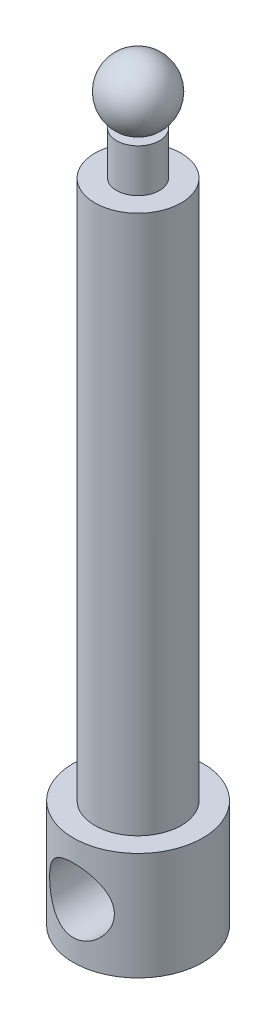
ISO-10303-21;
HEADER;
FILE_DESCRIPTION(('STEP AP214'),'2;1');
FILE_NAME('part.step','',(''),(''),'','','');
FILE_SCHEMA(('AUTOMOTIVE_DESIGN { 1 0 10303 214 1 1 1 1 }'));
ENDSEC;
DATA;
#1=APPLICATION_CONTEXT('core data for automotive mechanical design processes');
#2=APPLICATION_PROTOCOL_DEFINITION('international standard','automotive_design',2000,#1);
#3=PRODUCT_CONTEXT('',#1,'mechanical');
#4=PRODUCT('Part','Part','',(#3));
#5=PRODUCT_RELATED_PRODUCT_CATEGORY('part','',(#4));
#6=PRODUCT_DEFINITION_FORMATION('','',#4);
#7=PRODUCT_DEFINITION_CONTEXT('part definition',#1,'design');
#8=PRODUCT_DEFINITION('design','',#6,#7);
#9=PRODUCT_DEFINITION_SHAPE('','',#8);
#10=(LENGTH_UNIT() NAMED_UNIT(*) SI_UNIT(.MILLI.,.METRE.));
#11=(NAMED_UNIT(*) PLANE_ANGLE_UNIT() SI_UNIT($,.RADIAN.));
#12=(NAMED_UNIT(*) SI_UNIT($,.STERADIAN.) SOLID_ANGLE_UNIT());
#13=UNCERTAINTY_MEASURE_WITH_UNIT(LENGTH_MEASURE(1.E-05),#10,'distance_accuracy_value','');
#14=(GEOMETRIC_REPRESENTATION_CONTEXT(3) GLOBAL_UNCERTAINTY_ASSIGNED_CONTEXT((#13)) GLOBAL_UNIT_ASSIGNED_CONTEXT((#10,
#11,#12)) REPRESENTATION_CONTEXT('',''));
#15=CARTESIAN_POINT('',(0.,0.,0.));
#16=DIRECTION('',(0.,0.,1.));
#17=DIRECTION('',(1.,0.,0.));
#18=AXIS2_PLACEMENT_3D('',#15,#16,#17);
#19=CARTESIAN_POINT('',(0.,25.,0.));
#20=DIRECTION('',(0.,1.,0.));
#21=DIRECTION('',(0.,0.,1.));
#22=AXIS2_PLACEMENT_3D('',#19,#20,#21);
#23=PLANE('',#22);
#24=CARTESIAN_POINT('',(0.,25.,0.));
#25=DIRECTION('',(0.,1.,0.));
#26=DIRECTION('',(0.,0.,1.));
#27=AXIS2_PLACEMENT_3D('',#24,#25,#26);
#28=CIRCLE('',#27,2.);
#29=CARTESIAN_POINT('',(0.,25.,2.));
#30=VERTEX_POINT('',#29);
#31=EDGE_CURVE('E62',#30,#30,#28,.T.);
#32=ORIENTED_EDGE('',*,*,#31,.T.);
#33=EDGE_LOOP('',(#32));
#34=FACE_BOUND('',#33,.T.);
#35=CARTESIAN_POINT('',(0.,25.,0.));
#36=DIRECTION('',(0.,1.,0.));
#37=DIRECTION('',(0.,0.,1.));
#38=AXIS2_PLACEMENT_3D('',#35,#36,#37);
#39=CIRCLE('',#38,1.);
#40=CARTESIAN_POINT('',(0.,25.,1.));
#41=VERTEX_POINT('',#40);
#42=EDGE_CURVE('E115',#41,#41,#39,.T.);
#43=ORIENTED_EDGE('',*,*,#42,.F.);
#44=EDGE_LOOP('',(#43));
#45=FACE_BOUND('',#44,.T.);
#46=ADVANCED_FACE('F36',(#34,#45),#23,.T.);
#47=CARTESIAN_POINT('',(0.,25.,0.));
#48=DIRECTION('',(0.,-1.,0.));
#49=DIRECTION('',(0.,0.,-1.));
#50=AXIS2_PLACEMENT_3D('',#47,#48,#49);
#51=CYLINDRICAL_SURFACE('',#50,2.);
#52=ORIENTED_EDGE('',*,*,#31,.F.);
#53=EDGE_LOOP('',(#52));
#54=FACE_BOUND('',#53,.T.);
#55=CARTESIAN_POINT('',(0.,0.,0.));
#56=DIRECTION('',(0.,-1.,0.));
#57=DIRECTION('',(0.,0.,-1.));
#58=AXIS2_PLACEMENT_3D('',#55,#56,#57);
#59=CIRCLE('',#58,2.);
#60=CARTESIAN_POINT('',(0.,0.,-2.));
#61=VERTEX_POINT('',#60);
#62=EDGE_CURVE('E119',#61,#61,#59,.T.);
#63=ORIENTED_EDGE('',*,*,#62,.F.);
#64=EDGE_LOOP('',(#63));
#65=FACE_BOUND('',#64,.T.);
#66=ADVANCED_FACE('F38',(#54,#65),#51,.T.);
#67=CARTESIAN_POINT('',(0.,27.,0.));
#68=DIRECTION('',(0.,-1.,0.));
#69=DIRECTION('',(0.,0.,-1.));
#70=AXIS2_PLACEMENT_3D('',#67,#68,#69);
#71=CYLINDRICAL_SURFACE('',#70,1.);
#72=CARTESIAN_POINT('',(0.,27.,0.));
#73=DIRECTION('',(0.,1.,0.));
#74=DIRECTION('',(0.,0.,1.));
#75=AXIS2_PLACEMENT_3D('',#72,#73,#74);
#76=CIRCLE('',#75,1.);
#77=CARTESIAN_POINT('',(0.,27.,1.));
#78=VERTEX_POINT('',#77);
#79=EDGE_CURVE('E113',#78,#78,#76,.T.);
#80=ORIENTED_EDGE('',*,*,#79,.F.);
#81=EDGE_LOOP('',(#80));
#82=FACE_BOUND('',#81,.T.);
#83=ORIENTED_EDGE('',*,*,#42,.T.);
#84=EDGE_LOOP('',(#83));
#85=FACE_BOUND('',#84,.T.);
#86=ADVANCED_FACE('F97',(#82,#85),#71,.T.);
#87=CARTESIAN_POINT('',(0.,27.,0.));
#88=DIRECTION('',(0.,1.,0.));
#89=DIRECTION('',(0.,0.,1.));
#90=AXIS2_PLACEMENT_3D('',#87,#88,#89);
#91=PLANE('',#90);
#92=CARTESIAN_POINT('',(0.,27.,0.));
#93=DIRECTION('',(0.,1.,0.));
#94=DIRECTION('',(0.,0.,1.));
#95=AXIS2_PLACEMENT_3D('',#92,#93,#94);
#96=CIRCLE('',#95,0.279177848900644);
#97=CARTESIAN_POINT('',(0.,27.,0.279177848900644));
#98=VERTEX_POINT('',#97);
#99=EDGE_CURVE('E55',#98,#98,#96,.T.);
#100=ORIENTED_EDGE('',*,*,#99,.F.);
#101=EDGE_LOOP('',(#100));
#102=FACE_BOUND('',#101,.T.);
#103=ORIENTED_EDGE('',*,*,#79,.T.);
#104=EDGE_LOOP('',(#103));
#105=FACE_BOUND('',#104,.T.);
#106=ADVANCED_FACE('F88',(#102,#105),#91,.T.);
#107=CARTESIAN_POINT('',(0.,28.473790937916,0.));
#108=DIRECTION('',(0.,-1.,0.));
#109=DIRECTION('',(-1.,0.,0.));
#110=AXIS2_PLACEMENT_3D('',#107,#108,#109);
#111=SPHERICAL_SURFACE('',#110,1.5);
#112=ORIENTED_EDGE('',*,*,#99,.T.);
#113=EDGE_LOOP('',(#112));
#114=FACE_BOUND('',#113,.T.);
#115=ADVANCED_FACE('F82',(#114),#111,.T.);
#116=CARTESIAN_POINT('',(0.,0.,0.));
#117=DIRECTION('',(0.,-1.,0.));
#118=DIRECTION('',(0.,0.,-1.));
#119=AXIS2_PLACEMENT_3D('',#116,#117,#118);
#120=PLANE('',#119);
#121=CARTESIAN_POINT('',(0.,0.,0.));
#122=DIRECTION('',(0.,-1.,0.));
#123=DIRECTION('',(0.,0.,-1.));
#124=AXIS2_PLACEMENT_3D('',#121,#122,#123);
#125=CIRCLE('',#124,3.);
#126=CARTESIAN_POINT('',(0.,0.,-3.));
#127=VERTEX_POINT('',#126);
#128=EDGE_CURVE('E125',#127,#127,#125,.T.);
#129=ORIENTED_EDGE('',*,*,#128,.F.);
#130=EDGE_LOOP('',(#129));
#131=FACE_BOUND('',#130,.T.);
#132=ORIENTED_EDGE('',*,*,#62,.T.);
#133=EDGE_LOOP('',(#132));
#134=FACE_BOUND('',#133,.T.);
#135=ADVANCED_FACE('F80',(#131,#134),#120,.F.);
#136=CARTESIAN_POINT('',(0.,-5.,0.));
#137=DIRECTION('',(0.,1.,0.));
#138=DIRECTION('',(0.,0.,1.));
#139=AXIS2_PLACEMENT_3D('',#136,#137,#138);
#140=CYLINDRICAL_SURFACE('',#139,3.);
#141=CARTESIAN_POINT('',(0.,-1.,-3.));
#142=CARTESIAN_POINT('',(-0.0788579444268502,-1.00000495347579,-2.99999570107562));
#143=CARTESIAN_POINT('',(-0.157809899546344,-1.00625510968158,-2.99685736529635));
#144=CARTESIAN_POINT('',(-0.313380352903344,-1.03097932051231,-2.98461234055736));
#145=CARTESIAN_POINT('',(-0.389994130070444,-1.04947658949672,-2.97549431743379));
#146=CARTESIAN_POINT('',(-0.538400317320673,-1.09779071292494,-2.95224419105063));
#147=CARTESIAN_POINT('',(-0.610210204408719,-1.12756357637195,-2.93813158766306));
#148=CARTESIAN_POINT('',(-0.747708925209898,-1.19735593204748,-2.90618664773642));
#149=CARTESIAN_POINT('',(-0.813398240985089,-1.2373746163733,-2.88835460450288));
#150=CARTESIAN_POINT('',(-0.941261726642864,-1.32927587422793,-2.84934387387093));
#151=CARTESIAN_POINT('',(-1.00298281668316,-1.38172971885946,-2.82802798691306));
#152=CARTESIAN_POINT('',(-1.11716916730047,-1.49578221887056,-2.78489955370115));
#153=CARTESIAN_POINT('',(-1.16962737466015,-1.55738777765866,-2.76308664313552));
#154=CARTESIAN_POINT('',(-1.26787800067542,-1.69372502428507,-2.71948426796021));
#155=CARTESIAN_POINT('',(-1.31283800332746,-1.76910414751887,-2.69782780455198));
#156=CARTESIAN_POINT('',(-1.38925234033604,-1.92755100397932,-2.65928968158481));
#157=CARTESIAN_POINT('',(-1.4207163224495,-2.01061319308412,-2.64240461410484));
#158=CARTESIAN_POINT('',(-1.46719866328288,-2.17699765813288,-2.61686800556713));
#159=CARTESIAN_POINT('',(-1.48308878562066,-2.26000667810109,-2.6077840737557));
#160=CARTESIAN_POINT('',(-1.50064048996327,-2.42796825666922,-2.59772834922792));
#161=CARTESIAN_POINT('',(-1.50231613255961,-2.51291881130673,-2.59674854014932));
#162=CARTESIAN_POINT('',(-1.49203093075844,-2.67142903647305,-2.60266395385873));
#163=CARTESIAN_POINT('',(-1.48167683930523,-2.74513604683458,-2.6086314549302));
#164=CARTESIAN_POINT('',(-1.4504097735854,-2.88958286405956,-2.62614343100775));
#165=CARTESIAN_POINT('',(-1.42949343584648,-2.96032171795797,-2.63768968247664));
#166=CARTESIAN_POINT('',(-1.37731467057901,-3.09884369884849,-2.66531214619112));
#167=CARTESIAN_POINT('',(-1.34582260067399,-3.16651959817868,-2.68148760995998));
#168=CARTESIAN_POINT('',(-1.273562531502,-3.29595143888501,-2.71655106422106));
#169=CARTESIAN_POINT('',(-1.2327903657187,-3.35770470340013,-2.73544027170286));
#170=CARTESIAN_POINT('',(-1.13709908236918,-3.48178187911484,-2.77669736854929));
#171=CARTESIAN_POINT('',(-1.08104168755392,-3.54318531036424,-2.79920265355119));
#172=CARTESIAN_POINT('',(-0.95933336811206,-3.65610312788635,-2.84321434950611));
#173=CARTESIAN_POINT('',(-0.893677884861428,-3.70761278805082,-2.86472027938201));
#174=CARTESIAN_POINT('',(-0.750774758747772,-3.80152849154459,-2.90552980924446));
#175=CARTESIAN_POINT('',(-0.673130387399112,-3.84340070866861,-2.92468476243011));
#176=CARTESIAN_POINT('',(-0.510699323233194,-3.91314554356451,-2.95736821681863));
#177=CARTESIAN_POINT('',(-0.425918364397912,-3.94102927752275,-2.9709011841533));
#178=CARTESIAN_POINT('',(-0.259149737491052,-3.97971310557502,-2.98986500612153));
#179=CARTESIAN_POINT('',(-0.177512295822488,-3.99173685362017,-2.99587407451965));
#180=CARTESIAN_POINT('',(-0.0131693999240269,-4.00219709670173,-3.00109520188655));
#181=CARTESIAN_POINT('',(0.0695355298048636,-4.0006400284592,-3.00031048081978));
#182=CARTESIAN_POINT('',(0.226849457978981,-3.98468996737188,-2.99236788380152));
#183=CARTESIAN_POINT('',(0.301589112074895,-3.97130120090501,-2.98570868532252));
#184=CARTESIAN_POINT('',(0.447610338452912,-3.93364289215732,-2.9673325697226));
#185=CARTESIAN_POINT('',(0.518891528536631,-3.90937215031976,-2.95561509501618));
#186=CARTESIAN_POINT('',(0.658332912674359,-3.85000230035045,-2.92776377120382));
#187=CARTESIAN_POINT('',(0.726345595508705,-3.81461342482557,-2.91151322654446));
#188=CARTESIAN_POINT('',(0.855692042548907,-3.73433869653015,-2.87615961476126));
#189=CARTESIAN_POINT('',(0.917022944664887,-3.68944879810691,-2.85705533350407));
#190=CARTESIAN_POINT('',(1.03765153393382,-3.58635936200392,-2.81562332004297));
#191=CARTESIAN_POINT('',(1.09615811672854,-3.52728569733228,-2.79316327265249));
#192=CARTESIAN_POINT('',(1.20278448167828,-3.40011227308341,-2.7489358741323));
#193=CARTESIAN_POINT('',(1.25089707856781,-3.33200632172812,-2.72716901100071));
#194=CARTESIAN_POINT('',(1.33756187171853,-3.18453451874054,-2.68576788309734));
#195=CARTESIAN_POINT('',(1.37553824370037,-3.10478310085828,-2.66628794383591));
#196=CARTESIAN_POINT('',(1.43712423890206,-2.93873489863755,-2.63361108441202));
#197=CARTESIAN_POINT('',(1.46075237380052,-2.85244671029966,-2.62040607332625));
#198=CARTESIAN_POINT('',(1.49079253120031,-2.68463466567294,-2.60342251538703));
#199=CARTESIAN_POINT('',(1.49863949460818,-2.60344861984714,-2.59886075197597));
#200=CARTESIAN_POINT('',(1.5010337315643,-2.44082939925321,-2.59748031962405));
#201=CARTESIAN_POINT('',(1.49558676993486,-2.35939634689321,-2.60065829439585));
#202=CARTESIAN_POINT('',(1.47288918838996,-2.20677474769984,-2.61356793076615));
#203=CARTESIAN_POINT('',(1.45681247151455,-2.13534929478289,-2.62264641723988));
#204=CARTESIAN_POINT('',(1.41476303733662,-1.99628782086345,-2.64556524281479));
#205=CARTESIAN_POINT('',(1.38878713673988,-1.92865302686195,-2.65940711354503));
#206=CARTESIAN_POINT('',(1.32572361795085,-1.79406272352019,-2.69142795546804));
#207=CARTESIAN_POINT('',(1.28800670672355,-1.72745814725646,-2.70983583593881));
#208=CARTESIAN_POINT('',(1.20322645745609,-1.60108819572811,-2.74852997452291));
#209=CARTESIAN_POINT('',(1.15615825686234,-1.54132640421833,-2.76881720693416));
#210=CARTESIAN_POINT('',(1.04730498999206,-1.42278702646799,-2.81193484737138));
#211=CARTESIAN_POINT('',(0.984426634495891,-1.36501134647456,-2.83477474959942));
#212=CARTESIAN_POINT('',(0.849232209349795,-1.2606055248471,-2.87816628389896));
#213=CARTESIAN_POINT('',(0.776911084957795,-1.21398139079514,-2.89871667939293));
#214=CARTESIAN_POINT('',(0.623897395174418,-1.13314545593189,-2.93547014349806));
#215=CARTESIAN_POINT('',(0.543149255665095,-1.0990237461453,-2.95164144740899));
#216=CARTESIAN_POINT('',(0.376113151707129,-1.04528774836389,-2.9775201194848));
#217=CARTESIAN_POINT('',(0.289841699383649,-1.02563222979143,-2.98724585044602));
#218=CARTESIAN_POINT('',(0.168902919736342,-1.00915388337139,-2.99543192870217));
#219=CARTESIAN_POINT('',(0.135242819162347,-1.00572603870049,-2.99714048010376));
#220=CARTESIAN_POINT('',(0.0677275977076371,-1.00114800172887,-2.99942545465223));
#221=CARTESIAN_POINT('',(0.0338724714699425,-0.999997872294687,-3.00000184655071));
#222=CARTESIAN_POINT('',(0.,-1.,-3.));
#223=B_SPLINE_CURVE_WITH_KNOTS('',3,(#141,#142,#143,#144,#145,#146,#147,#148,#149,#150,#151,
#152,#153,#154,#155,#156,#157,#158,#159,#160,#161,#162,#163,#164,#165,#166,#167,#168,#169,#170,
#171,#172,#173,#174,#175,#176,#177,#178,#179,#180,#181,#182,#183,#184,#185,#186,#187,#188,#189,
#190,#191,#192,#193,#194,#195,#196,#197,#198,#199,#200,#201,#202,#203,#204,#205,#206,#207,#208,
#209,#210,#211,#212,#213,#214,#215,#216,#217,#218,#219,#220,#221,#222),.UNSPECIFIED.,.T.,.F.,(4,
2,2,2,2,2,2,2,2,2,2,2,2,2,2,2,2,2,2,2,2,2,2,2,2,2,2,2,2,2,2,2,2,2,2,2,2,2,2,2,4),(0.,
0.236436386130439,0.473322224563796,0.709293233238447,0.945245640872352,1.19547263807713,
1.44588935648105,1.71572589646129,1.98536921847421,2.23887018210344,2.49212035993531,
2.71508568613981,2.93812205888518,3.16635360252731,3.39468781890333,3.65197412000818,
3.9093830189803,4.17874533321661,4.4478932536842,4.69474935707019,4.94148846767214,
5.16910359759183,5.39674382446397,5.63089284041848,5.86514176122509,6.12239415966628,
6.37982382923148,6.64972023242589,6.91926767918176,7.1629396125457,7.40650589797018,
7.62686895373284,7.84730293182527,8.08254685170431,8.31791341715446,8.58187864135757,
8.84598575071869,9.1119602049529,9.37717362931724,9.47872920200875,9.58028757766599),.UNSPECIFIED.);
#224=CARTESIAN_POINT('',(0.,-1.,-3.));
#225=VERTEX_POINT('',#224);
#226=EDGE_CURVE('E10',#225,#225,#223,.T.);
#227=ORIENTED_EDGE('',*,*,#226,.T.);
#228=EDGE_LOOP('',(#227));
#229=FACE_BOUND('',#228,.T.);
#230=CARTESIAN_POINT('',(0.,-4.,3.));
#231=CARTESIAN_POINT('',(-0.0788579444268502,-3.99999504652421,2.99999570107562));
#232=CARTESIAN_POINT('',(-0.157809899546344,-3.99374489031842,2.99685736529635));
#233=CARTESIAN_POINT('',(-0.313380352903344,-3.96902067948769,2.98461234055736));
#234=CARTESIAN_POINT('',(-0.389994130070444,-3.95052341050328,2.97549431743379));
#235=CARTESIAN_POINT('',(-0.538400317320674,-3.90220928707506,2.95224419105063));
#236=CARTESIAN_POINT('',(-0.61021020440872,-3.87243642362805,2.93813158766306));
#237=CARTESIAN_POINT('',(-0.747708925209898,-3.80264406795252,2.90618664773642));
#238=CARTESIAN_POINT('',(-0.813398240985089,-3.7626253836267,2.88835460450288));
#239=CARTESIAN_POINT('',(-0.941261726642864,-3.67072412577207,2.84934387387093));
#240=CARTESIAN_POINT('',(-1.00298281668316,-3.61827028114054,2.82802798691306));
#241=CARTESIAN_POINT('',(-1.11716916730047,-3.50421778112944,2.78489955370115));
#242=CARTESIAN_POINT('',(-1.16962737466015,-3.44261222234134,2.76308664313552));
#243=CARTESIAN_POINT('',(-1.26787800067542,-3.30627497571493,2.71948426796021));
#244=CARTESIAN_POINT('',(-1.31283800332746,-3.23089585248113,2.69782780455198));
#245=CARTESIAN_POINT('',(-1.38925234033604,-3.07244899602068,2.65928968158481));
#246=CARTESIAN_POINT('',(-1.4207163224495,-2.98938680691587,2.64240461410484));
#247=CARTESIAN_POINT('',(-1.46719866328288,-2.82300234186711,2.61686800556713));
#248=CARTESIAN_POINT('',(-1.48308878562066,-2.73999332189891,2.6077840737557));
#249=CARTESIAN_POINT('',(-1.50064048996327,-2.57203174333078,2.59772834922792));
#250=CARTESIAN_POINT('',(-1.50231613255961,-2.48708118869327,2.59674854014932));
#251=CARTESIAN_POINT('',(-1.49203093075844,-2.32857096352695,2.60266395385873));
#252=CARTESIAN_POINT('',(-1.48167683930523,-2.25486395316542,2.6086314549302));
#253=CARTESIAN_POINT('',(-1.4504097735854,-2.11041713594044,2.62614343100776));
#254=CARTESIAN_POINT('',(-1.42949343584648,-2.03967828204203,2.63768968247665));
#255=CARTESIAN_POINT('',(-1.377314670579,-1.90115630115151,2.66531214619112));
#256=CARTESIAN_POINT('',(-1.34582260067399,-1.83348040182132,2.68148760995998));
#257=CARTESIAN_POINT('',(-1.273562531502,-1.70404856111499,2.71655106422106));
#258=CARTESIAN_POINT('',(-1.2327903657187,-1.64229529659987,2.73544027170286));
#259=CARTESIAN_POINT('',(-1.13709908236918,-1.51821812088516,2.77669736854929));
#260=CARTESIAN_POINT('',(-1.08104168755392,-1.45681468963576,2.79920265355119));
#261=CARTESIAN_POINT('',(-0.95933336811206,-1.34389687211365,2.84321434950611));
#262=CARTESIAN_POINT('',(-0.893677884861427,-1.29238721194918,2.86472027938201));
#263=CARTESIAN_POINT('',(-0.750774758747772,-1.19847150845541,2.90552980924446));
#264=CARTESIAN_POINT('',(-0.673130387399112,-1.15659929133139,2.92468476243011));
#265=CARTESIAN_POINT('',(-0.510699323233194,-1.08685445643549,2.95736821681863));
#266=CARTESIAN_POINT('',(-0.425918364397913,-1.05897072247725,2.9709011841533));
#267=CARTESIAN_POINT('',(-0.259149737491053,-1.02028689442498,2.98986500612153));
#268=CARTESIAN_POINT('',(-0.177512295822489,-1.00826314637983,2.99587407451965));
#269=CARTESIAN_POINT('',(-0.0131693999240269,-0.997802903298269,3.00109520188655));
#270=CARTESIAN_POINT('',(0.0695355298048637,-0.999359971540798,3.00031048081978));
#271=CARTESIAN_POINT('',(0.226849457978981,-1.01531003262812,2.99236788380152));
#272=CARTESIAN_POINT('',(0.301589112074896,-1.02869879909499,2.98570868532252));
#273=CARTESIAN_POINT('',(0.447610338452912,-1.06635710784268,2.9673325697226));
#274=CARTESIAN_POINT('',(0.518891528536631,-1.09062784968024,2.95561509501618));
#275=CARTESIAN_POINT('',(0.65833291267436,-1.14999769964955,2.92776377120382));
#276=CARTESIAN_POINT('',(0.726345595508706,-1.18538657517443,2.91151322654446));
#277=CARTESIAN_POINT('',(0.855692042548908,-1.26566130346985,2.87615961476126));
#278=CARTESIAN_POINT('',(0.917022944664888,-1.31055120189309,2.85705533350407));
#279=CARTESIAN_POINT('',(1.03765153393382,-1.41364063799608,2.81562332004297));
#280=CARTESIAN_POINT('',(1.09615811672854,-1.47271430266772,2.79316327265249));
#281=CARTESIAN_POINT('',(1.20278448167828,-1.59988772691659,2.7489358741323));
#282=CARTESIAN_POINT('',(1.25089707856781,-1.66799367827188,2.72716901100071));
#283=CARTESIAN_POINT('',(1.33756187171853,-1.81546548125946,2.68576788309734));
#284=CARTESIAN_POINT('',(1.37553824370037,-1.89521689914172,2.66628794383591));
#285=CARTESIAN_POINT('',(1.43712423890206,-2.06126510136245,2.63361108441202));
#286=CARTESIAN_POINT('',(1.46075237380052,-2.14755328970034,2.62040607332625));
#287=CARTESIAN_POINT('',(1.49079253120031,-2.31536533432706,2.60342251538703));
#288=CARTESIAN_POINT('',(1.49863949460818,-2.39655138015286,2.59886075197597));
#289=CARTESIAN_POINT('',(1.5010337315643,-2.55917060074679,2.59748031962405));
#290=CARTESIAN_POINT('',(1.49558676993486,-2.64060365310679,2.60065829439585));
#291=CARTESIAN_POINT('',(1.47288918838996,-2.79322525230016,2.61356793076615));
#292=CARTESIAN_POINT('',(1.45681247151455,-2.86465070521711,2.62264641723988));
#293=CARTESIAN_POINT('',(1.41476303733662,-3.00371217913655,2.64556524281479));
#294=CARTESIAN_POINT('',(1.38878713673988,-3.07134697313805,2.65940711354503));
#295=CARTESIAN_POINT('',(1.32572361795085,-3.20593727647981,2.69142795546804));
#296=CARTESIAN_POINT('',(1.28800670672355,-3.27254185274354,2.70983583593881));
#297=CARTESIAN_POINT('',(1.20322645745609,-3.39891180427189,2.74852997452291));
#298=CARTESIAN_POINT('',(1.15615825686234,-3.45867359578167,2.76881720693416));
#299=CARTESIAN_POINT('',(1.04730498999206,-3.57721297353201,2.81193484737138));
#300=CARTESIAN_POINT('',(0.984426634495892,-3.63498865352544,2.83477474959942));
#301=CARTESIAN_POINT('',(0.849232209349795,-3.7393944751529,2.87816628389896));
#302=CARTESIAN_POINT('',(0.776911084957796,-3.78601860920486,2.89871667939293));
#303=CARTESIAN_POINT('',(0.623897395174418,-3.86685454406811,2.93547014349806));
#304=CARTESIAN_POINT('',(0.543149255665096,-3.9009762538547,2.95164144740899));
#305=CARTESIAN_POINT('',(0.37611315170713,-3.95471225163611,2.9775201194848));
#306=CARTESIAN_POINT('',(0.28984169938365,-3.97436777020857,2.98724585044602));
#307=CARTESIAN_POINT('',(0.168902919736342,-3.99084611662861,2.99543192870217));
#308=CARTESIAN_POINT('',(0.135242819162347,-3.99427396129951,2.99714048010376));
#309=CARTESIAN_POINT('',(0.0677275977076367,-3.99885199827113,2.99942545465223));
#310=CARTESIAN_POINT('',(0.0338724714699424,-4.00000212770531,3.00000184655071));
#311=CARTESIAN_POINT('',(0.,-4.,3.));
#312=B_SPLINE_CURVE_WITH_KNOTS('',3,(#230,#231,#232,#233,#234,#235,#236,#237,#238,#239,#240,
#241,#242,#243,#244,#245,#246,#247,#248,#249,#250,#251,#252,#253,#254,#255,#256,#257,#258,#259,
#260,#261,#262,#263,#264,#265,#266,#267,#268,#269,#270,#271,#272,#273,#274,#275,#276,#277,#278,
#279,#280,#281,#282,#283,#284,#285,#286,#287,#288,#289,#290,#291,#292,#293,#294,#295,#296,#297,
#298,#299,#300,#301,#302,#303,#304,#305,#306,#307,#308,#309,#310,#311),.UNSPECIFIED.,.T.,.F.,(4,
2,2,2,2,2,2,2,2,2,2,2,2,2,2,2,2,2,2,2,2,2,2,2,2,2,2,2,2,2,2,2,2,2,2,2,2,2,2,2,4),(0.,
0.236436386130439,0.473322224563797,0.709293233238448,0.945245640872352,1.19547263807713,
1.44588935648105,1.71572589646129,1.98536921847422,2.23887018210345,2.49212035993531,
2.71508568613981,2.93812205888518,3.16635360252731,3.39468781890333,3.65197412000818,
3.90938301898029,4.17874533321661,4.44789325368419,4.69474935707018,4.94148846767214,
5.16910359759183,5.39674382446397,5.63089284041848,5.86514176122509,6.12239415966628,
6.37982382923148,6.64972023242589,6.91926767918176,7.1629396125457,7.40650589797018,
7.62686895373284,7.84730293182526,8.08254685170431,8.31791341715446,8.58187864135757,
8.84598575071868,9.1119602049529,9.37717362931724,9.47872920200875,9.58028757766599),.UNSPECIFIED.);
#313=CARTESIAN_POINT('',(0.,-4.,3.));
#314=VERTEX_POINT('',#313);
#315=EDGE_CURVE('E48',#314,#314,#312,.T.);
#316=ORIENTED_EDGE('',*,*,#315,.T.);
#317=EDGE_LOOP('',(#316));
#318=FACE_BOUND('',#317,.T.);
#319=CARTESIAN_POINT('',(0.,-5.,0.));
#320=DIRECTION('',(0.,-1.,0.));
#321=DIRECTION('',(0.,0.,-1.));
#322=AXIS2_PLACEMENT_3D('',#319,#320,#321);
#323=CIRCLE('',#322,3.);
#324=CARTESIAN_POINT('',(0.,-5.,-3.));
#325=VERTEX_POINT('',#324);
#326=EDGE_CURVE('E124',#325,#325,#323,.T.);
#327=ORIENTED_EDGE('',*,*,#326,.F.);
#328=EDGE_LOOP('',(#327));
#329=FACE_BOUND('',#328,.T.);
#330=ORIENTED_EDGE('',*,*,#128,.T.);
#331=EDGE_LOOP('',(#330));
#332=FACE_BOUND('',#331,.T.);
#333=ADVANCED_FACE('F67',(#229,#318,#329,#332),#140,.T.);
#334=CARTESIAN_POINT('',(0.,-5.,0.));
#335=DIRECTION('',(0.,-1.,0.));
#336=DIRECTION('',(0.,0.,-1.));
#337=AXIS2_PLACEMENT_3D('',#334,#335,#336);
#338=PLANE('',#337);
#339=ORIENTED_EDGE('',*,*,#326,.T.);
#340=EDGE_LOOP('',(#339));
#341=FACE_BOUND('',#340,.T.);
#342=ADVANCED_FACE('F75',(#341),#338,.T.);
#343=CARTESIAN_POINT('',(0.,-2.5,-3.));
#344=DIRECTION('',(0.,0.,1.));
#345=DIRECTION('',(1.,0.,0.));
#346=AXIS2_PLACEMENT_3D('',#343,#344,#345);
#347=CYLINDRICAL_SURFACE('',#346,1.5);
#348=ORIENTED_EDGE('',*,*,#226,.F.);
#349=EDGE_LOOP('',(#348));
#350=FACE_BOUND('',#349,.T.);
#351=ORIENTED_EDGE('',*,*,#315,.F.);
#352=EDGE_LOOP('',(#351));
#353=FACE_BOUND('',#352,.T.);
#354=ADVANCED_FACE('F71',(#350,#353),#347,.F.);
#355=CLOSED_SHELL('',(#46,#66,#86,#106,#115,#135,#333,#342,#354));
#356=MANIFOLD_SOLID_BREP('B2',#355);
#357=ADVANCED_BREP_SHAPE_REPRESENTATION('',(#18,#356),#14);
#358=SHAPE_DEFINITION_REPRESENTATION(#9,#357);
ENDSEC;
END-ISO-10303-21;
